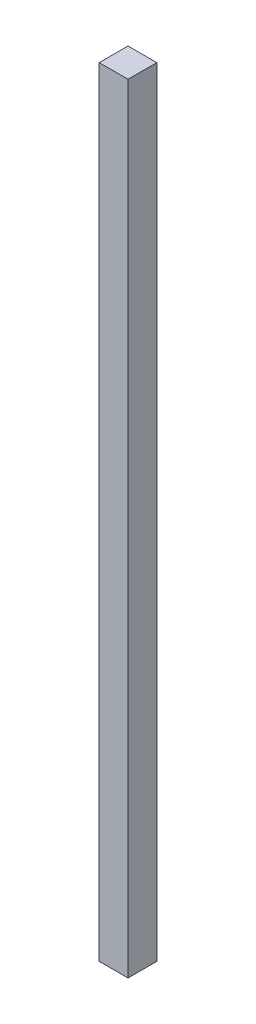
ISO-10303-21;
HEADER;
FILE_DESCRIPTION(('STEP AP214'),'2;1');
FILE_NAME('part.step','',(''),(''),'','','');
FILE_SCHEMA(('AUTOMOTIVE_DESIGN { 1 0 10303 214 1 1 1 1 }'));
ENDSEC;
DATA;
#1=APPLICATION_CONTEXT('core data for automotive mechanical design processes');
#2=APPLICATION_PROTOCOL_DEFINITION('international standard','automotive_design',2000,#1);
#3=PRODUCT_CONTEXT('',#1,'mechanical');
#4=PRODUCT('Part','Part','',(#3));
#5=PRODUCT_RELATED_PRODUCT_CATEGORY('part','',(#4));
#6=PRODUCT_DEFINITION_FORMATION('','',#4);
#7=PRODUCT_DEFINITION_CONTEXT('part definition',#1,'design');
#8=PRODUCT_DEFINITION('design','',#6,#7);
#9=PRODUCT_DEFINITION_SHAPE('','',#8);
#10=(LENGTH_UNIT() NAMED_UNIT(*) SI_UNIT(.MILLI.,.METRE.));
#11=(NAMED_UNIT(*) PLANE_ANGLE_UNIT() SI_UNIT($,.RADIAN.));
#12=(NAMED_UNIT(*) SI_UNIT($,.STERADIAN.) SOLID_ANGLE_UNIT());
#13=UNCERTAINTY_MEASURE_WITH_UNIT(LENGTH_MEASURE(1.E-05),#10,'distance_accuracy_value','');
#14=(GEOMETRIC_REPRESENTATION_CONTEXT(3) GLOBAL_UNCERTAINTY_ASSIGNED_CONTEXT((#13)) GLOBAL_UNIT_ASSIGNED_CONTEXT((#10,
#11,#12)) REPRESENTATION_CONTEXT('',''));
#15=CARTESIAN_POINT('',(0.,0.,0.));
#16=DIRECTION('',(0.,0.,1.));
#17=DIRECTION('',(1.,0.,0.));
#18=AXIS2_PLACEMENT_3D('',#15,#16,#17);
#19=CARTESIAN_POINT('',(18.5,1000.,-18.5));
#20=DIRECTION('',(-1.,0.,0.));
#21=DIRECTION('',(0.,0.,1.));
#22=AXIS2_PLACEMENT_3D('',#19,#20,#21);
#23=PLANE('',#22);
#24=DIRECTION('',(0.,0.,-1.));
#25=VECTOR('',#24,1.);
#26=CARTESIAN_POINT('',(18.5,0.,-18.5));
#27=LINE('',#26,#25);
#28=CARTESIAN_POINT('',(18.5,0.,18.5));
#29=VERTEX_POINT('',#28);
#30=CARTESIAN_POINT('',(18.5,0.,-18.5));
#31=VERTEX_POINT('',#30);
#32=EDGE_CURVE('E100',#29,#31,#27,.T.);
#33=ORIENTED_EDGE('',*,*,#32,.T.);
#34=DIRECTION('',(0.,-1.,0.));
#35=VECTOR('',#34,1.);
#36=CARTESIAN_POINT('',(18.5,1000.,-18.5));
#37=LINE('',#36,#35);
#38=CARTESIAN_POINT('',(18.5,1000.,-18.5));
#39=VERTEX_POINT('',#38);
#40=EDGE_CURVE('E11',#39,#31,#37,.T.);
#41=ORIENTED_EDGE('',*,*,#40,.F.);
#42=DIRECTION('',(0.,0.,-1.));
#43=VECTOR('',#42,1.);
#44=CARTESIAN_POINT('',(18.5,1000.,-18.5));
#45=LINE('',#44,#43);
#46=CARTESIAN_POINT('',(18.5,1000.,18.5));
#47=VERTEX_POINT('',#46);
#48=EDGE_CURVE('E88',#47,#39,#45,.T.);
#49=ORIENTED_EDGE('',*,*,#48,.F.);
#50=DIRECTION('',(0.,-1.,0.));
#51=VECTOR('',#50,1.);
#52=CARTESIAN_POINT('',(18.5,1000.,18.5));
#53=LINE('',#52,#51);
#54=EDGE_CURVE('E96',#47,#29,#53,.T.);
#55=ORIENTED_EDGE('',*,*,#54,.T.);
#56=EDGE_LOOP('',(#33,#41,#49,#55));
#57=FACE_BOUND('',#56,.T.);
#58=ADVANCED_FACE('F37',(#57),#23,.F.);
#59=CARTESIAN_POINT('',(-18.5,1000.,-18.5));
#60=DIRECTION('',(0.,0.,1.));
#61=DIRECTION('',(1.,0.,0.));
#62=AXIS2_PLACEMENT_3D('',#59,#60,#61);
#63=PLANE('',#62);
#64=DIRECTION('',(-1.,0.,0.));
#65=VECTOR('',#64,1.);
#66=CARTESIAN_POINT('',(-18.5,0.,-18.5));
#67=LINE('',#66,#65);
#68=CARTESIAN_POINT('',(-18.5,0.,-18.5));
#69=VERTEX_POINT('',#68);
#70=EDGE_CURVE('E92',#31,#69,#67,.T.);
#71=ORIENTED_EDGE('',*,*,#70,.T.);
#72=DIRECTION('',(0.,-1.,0.));
#73=VECTOR('',#72,1.);
#74=CARTESIAN_POINT('',(-18.5,1000.,-18.5));
#75=LINE('',#74,#73);
#76=CARTESIAN_POINT('',(-18.5,1000.,-18.5));
#77=VERTEX_POINT('',#76);
#78=EDGE_CURVE('E45',#77,#69,#75,.T.);
#79=ORIENTED_EDGE('',*,*,#78,.F.);
#80=DIRECTION('',(-1.,0.,0.));
#81=VECTOR('',#80,1.);
#82=CARTESIAN_POINT('',(-18.5,1000.,-18.5));
#83=LINE('',#82,#81);
#84=EDGE_CURVE('E83',#39,#77,#83,.T.);
#85=ORIENTED_EDGE('',*,*,#84,.F.);
#86=ORIENTED_EDGE('',*,*,#40,.T.);
#87=EDGE_LOOP('',(#71,#79,#85,#86));
#88=FACE_BOUND('',#87,.T.);
#89=ADVANCED_FACE('F91',(#88),#63,.F.);
#90=CARTESIAN_POINT('',(-18.5,1000.,-18.5));
#91=DIRECTION('',(1.,0.,0.));
#92=DIRECTION('',(0.,0.,-1.));
#93=AXIS2_PLACEMENT_3D('',#90,#91,#92);
#94=PLANE('',#93);
#95=DIRECTION('',(0.,0.,1.));
#96=VECTOR('',#95,1.);
#97=CARTESIAN_POINT('',(-18.5,0.,-18.5));
#98=LINE('',#97,#96);
#99=CARTESIAN_POINT('',(-18.5,0.,18.5));
#100=VERTEX_POINT('',#99);
#101=EDGE_CURVE('E70',#69,#100,#98,.T.);
#102=ORIENTED_EDGE('',*,*,#101,.T.);
#103=DIRECTION('',(0.,-1.,0.));
#104=VECTOR('',#103,1.);
#105=CARTESIAN_POINT('',(-18.5,1000.,18.5));
#106=LINE('',#105,#104);
#107=CARTESIAN_POINT('',(-18.5,1000.,18.5));
#108=VERTEX_POINT('',#107);
#109=EDGE_CURVE('E93',#108,#100,#106,.T.);
#110=ORIENTED_EDGE('',*,*,#109,.F.);
#111=DIRECTION('',(0.,0.,1.));
#112=VECTOR('',#111,1.);
#113=CARTESIAN_POINT('',(-18.5,1000.,-18.5));
#114=LINE('',#113,#112);
#115=EDGE_CURVE('E86',#77,#108,#114,.T.);
#116=ORIENTED_EDGE('',*,*,#115,.F.);
#117=ORIENTED_EDGE('',*,*,#78,.T.);
#118=EDGE_LOOP('',(#102,#110,#116,#117));
#119=FACE_BOUND('',#118,.T.);
#120=ADVANCED_FACE('F94',(#119),#94,.F.);
#121=CARTESIAN_POINT('',(-18.5,1000.,18.5));
#122=DIRECTION('',(0.,0.,-1.));
#123=DIRECTION('',(-1.,0.,0.));
#124=AXIS2_PLACEMENT_3D('',#121,#122,#123);
#125=PLANE('',#124);
#126=DIRECTION('',(1.,0.,0.));
#127=VECTOR('',#126,1.);
#128=CARTESIAN_POINT('',(-18.5,0.,18.5));
#129=LINE('',#128,#127);
#130=EDGE_CURVE('E76',#100,#29,#129,.T.);
#131=ORIENTED_EDGE('',*,*,#130,.T.);
#132=ORIENTED_EDGE('',*,*,#54,.F.);
#133=DIRECTION('',(1.,0.,0.));
#134=VECTOR('',#133,1.);
#135=CARTESIAN_POINT('',(-18.5,1000.,18.5));
#136=LINE('',#135,#134);
#137=EDGE_CURVE('E53',#108,#47,#136,.T.);
#138=ORIENTED_EDGE('',*,*,#137,.F.);
#139=ORIENTED_EDGE('',*,*,#109,.T.);
#140=EDGE_LOOP('',(#131,#132,#138,#139));
#141=FACE_BOUND('',#140,.T.);
#142=ADVANCED_FACE('F107',(#141),#125,.F.);
#143=CARTESIAN_POINT('',(0.,1000.,0.));
#144=DIRECTION('',(0.,1.,0.));
#145=DIRECTION('',(0.,0.,1.));
#146=AXIS2_PLACEMENT_3D('',#143,#144,#145);
#147=PLANE('',#146);
#148=ORIENTED_EDGE('',*,*,#48,.T.);
#149=ORIENTED_EDGE('',*,*,#84,.T.);
#150=ORIENTED_EDGE('',*,*,#115,.T.);
#151=ORIENTED_EDGE('',*,*,#137,.T.);
#152=EDGE_LOOP('',(#148,#149,#150,#151));
#153=FACE_BOUND('',#152,.T.);
#154=ADVANCED_FACE('F84',(#153),#147,.T.);
#155=CARTESIAN_POINT('',(0.,0.,0.));
#156=DIRECTION('',(0.,1.,0.));
#157=DIRECTION('',(0.,0.,1.));
#158=AXIS2_PLACEMENT_3D('',#155,#156,#157);
#159=PLANE('',#158);
#160=ORIENTED_EDGE('',*,*,#32,.F.);
#161=ORIENTED_EDGE('',*,*,#130,.F.);
#162=ORIENTED_EDGE('',*,*,#101,.F.);
#163=ORIENTED_EDGE('',*,*,#70,.F.);
#164=EDGE_LOOP('',(#160,#161,#162,#163));
#165=FACE_BOUND('',#164,.T.);
#166=ADVANCED_FACE('F110',(#165),#159,.F.);
#167=CLOSED_SHELL('',(#58,#89,#120,#142,#154,#166));
#168=MANIFOLD_SOLID_BREP('B2',#167);
#169=ADVANCED_BREP_SHAPE_REPRESENTATION('',(#18,#168),#14);
#170=SHAPE_DEFINITION_REPRESENTATION(#9,#169);
ENDSEC;
END-ISO-10303-21;
